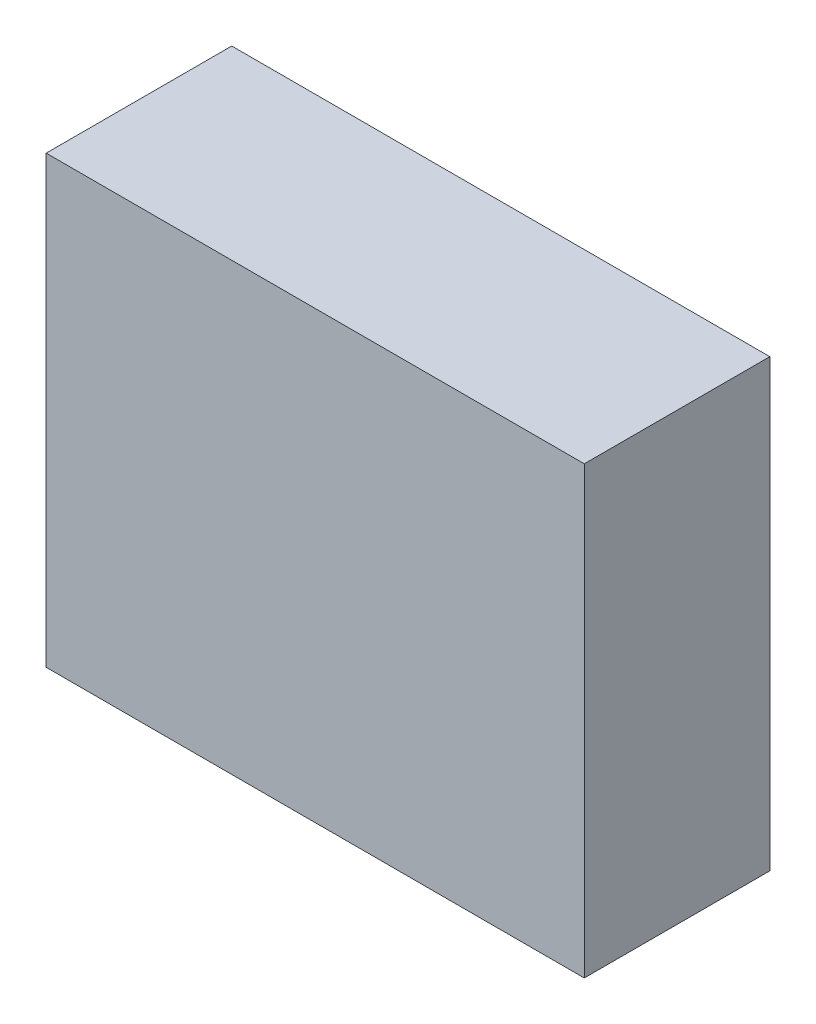
ISO-10303-21;
HEADER;
FILE_DESCRIPTION(('STEP AP214'),'2;1');
FILE_NAME('part.step','',(''),(''),'','','');
FILE_SCHEMA(('AUTOMOTIVE_DESIGN { 1 0 10303 214 1 1 1 1 }'));
ENDSEC;
DATA;
#1=APPLICATION_CONTEXT('core data for automotive mechanical design processes');
#2=APPLICATION_PROTOCOL_DEFINITION('international standard','automotive_design',2000,#1);
#3=PRODUCT_CONTEXT('',#1,'mechanical');
#4=PRODUCT('Part','Part','',(#3));
#5=PRODUCT_RELATED_PRODUCT_CATEGORY('part','',(#4));
#6=PRODUCT_DEFINITION_FORMATION('','',#4);
#7=PRODUCT_DEFINITION_CONTEXT('part definition',#1,'design');
#8=PRODUCT_DEFINITION('design','',#6,#7);
#9=PRODUCT_DEFINITION_SHAPE('','',#8);
#10=(LENGTH_UNIT() NAMED_UNIT(*) SI_UNIT(.MILLI.,.METRE.));
#11=(NAMED_UNIT(*) PLANE_ANGLE_UNIT() SI_UNIT($,.RADIAN.));
#12=(NAMED_UNIT(*) SI_UNIT($,.STERADIAN.) SOLID_ANGLE_UNIT());
#13=UNCERTAINTY_MEASURE_WITH_UNIT(LENGTH_MEASURE(1.E-05),#10,'distance_accuracy_value','');
#14=(GEOMETRIC_REPRESENTATION_CONTEXT(3) GLOBAL_UNCERTAINTY_ASSIGNED_CONTEXT((#13)) GLOBAL_UNIT_ASSIGNED_CONTEXT((#10,
#11,#12)) REPRESENTATION_CONTEXT('',''));
#15=CARTESIAN_POINT('',(0.,0.,0.));
#16=DIRECTION('',(0.,0.,1.));
#17=DIRECTION('',(1.,0.,0.));
#18=AXIS2_PLACEMENT_3D('',#15,#16,#17);
#19=CARTESIAN_POINT('',(0.496199068300616,16.5859707480032,-0.109999083028137));
#20=CARTESIAN_POINT('',(0.148199068300634,16.585970752153,-0.109999083028136));
#21=CARTESIAN_POINT('',(0.496199068300616,16.5859707375124,0.0100009169718631));
#22=CARTESIAN_POINT('',(0.148199068300633,16.5859707416623,0.0100009169718635));
#23=(BOUNDED_SURFACE() B_SPLINE_SURFACE(1,1,((#19,#20),(#21,#22)),.UNSPECIFIED.,.F.,.F.,
.F.) B_SPLINE_SURFACE_WITH_KNOTS((2,2),(2,2),(-1.E-05,0.00011),(-0.000318999999999984,
2.89999999999985E-05),
.UNSPECIFIED.) GEOMETRIC_REPRESENTATION_ITEM() RATIONAL_B_SPLINE_SURFACE(((1.,1.),(1.,1.))) REPRESENTATION_ITEM('') SURFACE());
#24=CARTESIAN_POINT('',(0.177199068300632,16.585970750933,-0.0999990830281364));
#25=CARTESIAN_POINT('',(0.467199068300617,16.5859707474748,-0.0999990830281367));
#26=(BOUNDED_CURVE() B_SPLINE_CURVE(1,(#24,#25),.UNSPECIFIED.,.F.,
.F.) B_SPLINE_CURVE_WITH_KNOTS((2,2),(0.,0.000289999999999985),
.UNSPECIFIED.) CURVE() GEOMETRIC_REPRESENTATION_ITEM() RATIONAL_B_SPLINE_CURVE((1.,1.)) REPRESENTATION_ITEM(''));
#27=CARTESIAN_POINT('',(0.177199068300632,16.585970750933,-0.0999990830281364));
#28=VERTEX_POINT('',#27);
#29=CARTESIAN_POINT('',(0.467199068300617,16.5859707474748,-0.0999990830281368));
#30=VERTEX_POINT('',#29);
#31=EDGE_CURVE('E62',#28,#30,#26,.T.);
#32=CARTESIAN_POINT('',(0.467199068300617,16.5859707387325,9.16971863024196E-07));
#33=CARTESIAN_POINT('',(0.467199068300617,16.5859707474748,-0.0999990830281368));
#34=(BOUNDED_CURVE() B_SPLINE_CURVE(1,(#32,#33),.UNSPECIFIED.,.F.,
.F.) B_SPLINE_CURVE_WITH_KNOTS((2,2),(0.,0.0001),
.UNSPECIFIED.) CURVE() GEOMETRIC_REPRESENTATION_ITEM() RATIONAL_B_SPLINE_CURVE((1.,1.)) REPRESENTATION_ITEM(''));
#35=CARTESIAN_POINT('',(0.467199068300617,16.5859707387325,9.16971863024196E-07));
#36=VERTEX_POINT('',#35);
#37=EDGE_CURVE('E91',#36,#30,#34,.T.);
#38=CARTESIAN_POINT('',(0.177199068300632,16.5859707421907,9.16971863457877E-07));
#39=CARTESIAN_POINT('',(0.467199068300617,16.5859707387325,9.1697186315555E-07));
#40=(BOUNDED_CURVE() B_SPLINE_CURVE(1,(#38,#39),.UNSPECIFIED.,.F.,
.F.) B_SPLINE_CURVE_WITH_KNOTS((2,2),(0.,0.000289999999999985),
.UNSPECIFIED.) CURVE() GEOMETRIC_REPRESENTATION_ITEM() RATIONAL_B_SPLINE_CURVE((1.,1.)) REPRESENTATION_ITEM(''));
#41=CARTESIAN_POINT('',(0.177199068300632,16.5859707421907,9.16971863457877E-07));
#42=VERTEX_POINT('',#41);
#43=EDGE_CURVE('E64',#42,#36,#40,.T.);
#44=CARTESIAN_POINT('',(0.177199068300632,16.5859707421907,9.16971863457877E-07));
#45=CARTESIAN_POINT('',(0.177199068300632,16.585970750933,-0.0999990830281364));
#46=(BOUNDED_CURVE() B_SPLINE_CURVE(1,(#44,#45),.UNSPECIFIED.,.F.,
.F.) B_SPLINE_CURVE_WITH_KNOTS((2,2),(0.,0.0001),
.UNSPECIFIED.) CURVE() GEOMETRIC_REPRESENTATION_ITEM() RATIONAL_B_SPLINE_CURVE((1.,1.)) REPRESENTATION_ITEM(''));
#47=EDGE_CURVE('E11',#42,#28,#46,.T.);
#48=ORIENTED_EDGE('',*,*,#31,.T.);
#49=ORIENTED_EDGE('',*,*,#37,.F.);
#50=ORIENTED_EDGE('',*,*,#43,.F.);
#51=ORIENTED_EDGE('',*,*,#47,.T.);
#52=EDGE_LOOP('',(#48,#49,#50,#51));
#53=FACE_BOUND('',#52,.T.);
#54=ADVANCED_FACE('F17',(#53),#23,.T.);
#55=CARTESIAN_POINT('',(0.496199071162606,16.8259707375124,0.0100009379533193));
#56=CARTESIAN_POINT('',(0.148199071162592,16.8259707416623,0.0100009379533196));
#57=CARTESIAN_POINT('',(0.496199071162606,16.8259707480032,-0.109999062046681));
#58=CARTESIAN_POINT('',(0.148199071162592,16.825970752153,-0.10999906204668));
#59=(BOUNDED_SURFACE() B_SPLINE_SURFACE(1,1,((#55,#56),(#57,#58)),.UNSPECIFIED.,.F.,.F.,
.F.) B_SPLINE_SURFACE_WITH_KNOTS((2,2),(2,2),(-1.E-05,0.00011),(-0.000319000000000013,
2.90000000000012E-05),
.UNSPECIFIED.) GEOMETRIC_REPRESENTATION_ITEM() RATIONAL_B_SPLINE_SURFACE(((1.,1.),(1.,1.))) REPRESENTATION_ITEM('') SURFACE());
#60=CARTESIAN_POINT('',(0.177199071162593,16.8259707421907,9.37953319613688E-07));
#61=CARTESIAN_POINT('',(0.177199071162593,16.825970750933,-0.0999990620466802));
#62=(BOUNDED_CURVE() B_SPLINE_CURVE(1,(#60,#61),.UNSPECIFIED.,.F.,
.F.) B_SPLINE_CURVE_WITH_KNOTS((2,2),(0.,0.0001),
.UNSPECIFIED.) CURVE() GEOMETRIC_REPRESENTATION_ITEM() RATIONAL_B_SPLINE_CURVE((1.,1.)) REPRESENTATION_ITEM(''));
#63=CARTESIAN_POINT('',(0.177199071162593,16.8259707421907,9.37953319613688E-07));
#64=VERTEX_POINT('',#63);
#65=CARTESIAN_POINT('',(0.177199071162593,16.825970750933,-0.0999990620466802));
#66=VERTEX_POINT('',#65);
#67=EDGE_CURVE('E23',#64,#66,#62,.T.);
#68=CARTESIAN_POINT('',(0.177199071162593,16.8259707421907,9.37953319613688E-07));
#69=CARTESIAN_POINT('',(0.467199071162605,16.8259707387325,9.37953319311361E-07));
#70=(BOUNDED_CURVE() B_SPLINE_CURVE(1,(#68,#69),.UNSPECIFIED.,.F.,
.F.) B_SPLINE_CURVE_WITH_KNOTS((2,2),(0.,0.000290000000000012),
.UNSPECIFIED.) CURVE() GEOMETRIC_REPRESENTATION_ITEM() RATIONAL_B_SPLINE_CURVE((1.,1.)) REPRESENTATION_ITEM(''));
#71=CARTESIAN_POINT('',(0.467199071162605,16.8259707387325,9.37953319180007E-07));
#72=VERTEX_POINT('',#71);
#73=EDGE_CURVE('E138',#64,#72,#70,.T.);
#74=CARTESIAN_POINT('',(0.467199071162605,16.8259707387325,9.37953319180007E-07));
#75=CARTESIAN_POINT('',(0.467199071162605,16.8259707474748,-0.0999990620466806));
#76=(BOUNDED_CURVE() B_SPLINE_CURVE(1,(#74,#75),.UNSPECIFIED.,.F.,
.F.) B_SPLINE_CURVE_WITH_KNOTS((2,2),(0.,0.0001),
.UNSPECIFIED.) CURVE() GEOMETRIC_REPRESENTATION_ITEM() RATIONAL_B_SPLINE_CURVE((1.,1.)) REPRESENTATION_ITEM(''));
#77=CARTESIAN_POINT('',(0.467199071162605,16.8259707474748,-0.0999990620466806));
#78=VERTEX_POINT('',#77);
#79=EDGE_CURVE('E98',#72,#78,#76,.T.);
#80=CARTESIAN_POINT('',(0.177199071162593,16.825970750933,-0.0999990620466802));
#81=CARTESIAN_POINT('',(0.467199071162605,16.8259707474748,-0.0999990620466805));
#82=(BOUNDED_CURVE() B_SPLINE_CURVE(1,(#80,#81),.UNSPECIFIED.,.F.,
.F.) B_SPLINE_CURVE_WITH_KNOTS((2,2),(0.,0.000290000000000012),
.UNSPECIFIED.) CURVE() GEOMETRIC_REPRESENTATION_ITEM() RATIONAL_B_SPLINE_CURVE((1.,1.)) REPRESENTATION_ITEM(''));
#83=EDGE_CURVE('E72',#66,#78,#82,.T.);
#84=ORIENTED_EDGE('',*,*,#67,.F.);
#85=ORIENTED_EDGE('',*,*,#73,.T.);
#86=ORIENTED_EDGE('',*,*,#79,.T.);
#87=ORIENTED_EDGE('',*,*,#83,.F.);
#88=EDGE_LOOP('',(#84,#85,#86,#87));
#89=FACE_BOUND('',#88,.T.);
#90=ADVANCED_FACE('F166',(#89),#59,.T.);
#91=CARTESIAN_POINT('',(0.177199068014435,16.5619707518072,-0.109999085126282));
#92=CARTESIAN_POINT('',(0.1771990714488,16.8499707518072,-0.109999059948535));
#93=CARTESIAN_POINT('',(0.177199068014435,16.5619707413165,0.0100009148737178));
#94=CARTESIAN_POINT('',(0.1771990714488,16.8499707413165,0.0100009400514652));
#95=(BOUNDED_SURFACE() B_SPLINE_SURFACE(1,1,((#91,#92),(#93,#94)),.UNSPECIFIED.,.F.,.F.,
.F.) B_SPLINE_SURFACE_WITH_KNOTS((2,2),(2,2),(-1.E-05,0.00011),(-2.4000000000004E-05,
0.000264000000000031),
.UNSPECIFIED.) GEOMETRIC_REPRESENTATION_ITEM() RATIONAL_B_SPLINE_SURFACE(((1.,1.),(1.,1.))) REPRESENTATION_ITEM('') SURFACE());
#96=CARTESIAN_POINT('',(0.177199068300632,16.585970750933,-0.0999990830281364));
#97=CARTESIAN_POINT('',(0.177199071162603,16.825970750933,-0.0999990620466803));
#98=(BOUNDED_CURVE() B_SPLINE_CURVE(1,(#96,#97),.UNSPECIFIED.,.F.,
.F.) B_SPLINE_CURVE_WITH_KNOTS((2,2),(0.,0.00024),
.UNSPECIFIED.) CURVE() GEOMETRIC_REPRESENTATION_ITEM() RATIONAL_B_SPLINE_CURVE((1.,1.)) REPRESENTATION_ITEM(''));
#99=EDGE_CURVE('E67',#28,#66,#98,.T.);
#100=CARTESIAN_POINT('',(0.177199068300632,16.5859707421907,9.16971863457877E-07));
#101=CARTESIAN_POINT('',(0.177199071162603,16.8259707421907,9.37953319603695E-07));
#102=(BOUNDED_CURVE() B_SPLINE_CURVE(1,(#100,#101),.UNSPECIFIED.,.F.,
.F.) B_SPLINE_CURVE_WITH_KNOTS((2,2),(0.,0.00024),
.UNSPECIFIED.) CURVE() GEOMETRIC_REPRESENTATION_ITEM() RATIONAL_B_SPLINE_CURVE((1.,1.)) REPRESENTATION_ITEM(''));
#103=EDGE_CURVE('E118',#42,#64,#102,.T.);
#104=ORIENTED_EDGE('',*,*,#67,.T.);
#105=ORIENTED_EDGE('',*,*,#99,.F.);
#106=ORIENTED_EDGE('',*,*,#47,.F.);
#107=ORIENTED_EDGE('',*,*,#103,.T.);
#108=EDGE_LOOP('',(#104,#105,#106,#107));
#109=FACE_BOUND('',#108,.T.);
#110=ADVANCED_FACE('F68',(#109),#95,.T.);
#111=CARTESIAN_POINT('',(0.46719906801442,16.5619707378583,0.0100009148737174));
#112=CARTESIAN_POINT('',(0.467199071448785,16.8499707378583,0.0100009400514648));
#113=CARTESIAN_POINT('',(0.46719906801442,16.561970748349,-0.109999085126282));
#114=CARTESIAN_POINT('',(0.467199071448785,16.849970748349,-0.109999059948535));
#115=(BOUNDED_SURFACE() B_SPLINE_SURFACE(1,1,((#111,#112),(#113,#114)),.UNSPECIFIED.,.F.,.F.,
.F.) B_SPLINE_SURFACE_WITH_KNOTS((2,2),(2,2),(-1.E-05,0.00011),(-2.4000000000004E-05,
0.000264000000000031),
.UNSPECIFIED.) GEOMETRIC_REPRESENTATION_ITEM() RATIONAL_B_SPLINE_SURFACE(((1.,1.),(1.,1.))) REPRESENTATION_ITEM('') SURFACE());
#116=CARTESIAN_POINT('',(0.467199068300617,16.5859707387325,9.16971863024196E-07));
#117=CARTESIAN_POINT('',(0.467199071162588,16.8259707387325,9.37953319170014E-07));
#118=(BOUNDED_CURVE() B_SPLINE_CURVE(1,(#116,#117),.UNSPECIFIED.,.F.,
.F.) B_SPLINE_CURVE_WITH_KNOTS((2,2),(0.,0.00024),
.UNSPECIFIED.) CURVE() GEOMETRIC_REPRESENTATION_ITEM() RATIONAL_B_SPLINE_CURVE((1.,1.)) REPRESENTATION_ITEM(''));
#119=EDGE_CURVE('E87',#36,#72,#118,.T.);
#120=CARTESIAN_POINT('',(0.467199068300617,16.5859707474748,-0.0999990830281368));
#121=CARTESIAN_POINT('',(0.467199071162588,16.8259707474748,-0.0999990620466807));
#122=(BOUNDED_CURVE() B_SPLINE_CURVE(1,(#120,#121),.UNSPECIFIED.,.F.,
.F.) B_SPLINE_CURVE_WITH_KNOTS((2,2),(0.,0.00024),
.UNSPECIFIED.) CURVE() GEOMETRIC_REPRESENTATION_ITEM() RATIONAL_B_SPLINE_CURVE((1.,1.)) REPRESENTATION_ITEM(''));
#123=EDGE_CURVE('E77',#30,#78,#122,.T.);
#124=ORIENTED_EDGE('',*,*,#119,.F.);
#125=ORIENTED_EDGE('',*,*,#37,.T.);
#126=ORIENTED_EDGE('',*,*,#123,.T.);
#127=ORIENTED_EDGE('',*,*,#79,.F.);
#128=EDGE_LOOP('',(#124,#125,#126,#127));
#129=FACE_BOUND('',#128,.T.);
#130=ADVANCED_FACE('F19',(#129),#115,.T.);
#131=CARTESIAN_POINT('',(0.148199071448789,16.8499707425365,9.40051465248511E-07));
#132=CARTESIAN_POINT('',(0.496199071448803,16.8499707383867,9.40051464885719E-07));
#133=CARTESIAN_POINT('',(0.148199068014423,16.5619707425365,9.14873717873527E-07));
#134=CARTESIAN_POINT('',(0.496199068014437,16.5619707383867,9.14873717510735E-07));
#135=(BOUNDED_SURFACE() B_SPLINE_SURFACE(1,1,((#131,#132),(#133,#134)),.UNSPECIFIED.,.F.,.F.,
.F.) B_SPLINE_SURFACE_WITH_KNOTS((2,2),(2,2),(-2.40000000000056E-05,0.00026400000000002),
(-2.90000000000115E-05,0.000319),
.UNSPECIFIED.) GEOMETRIC_REPRESENTATION_ITEM() RATIONAL_B_SPLINE_SURFACE(((1.,1.),(1.,1.))) REPRESENTATION_ITEM('') SURFACE());
#136=ORIENTED_EDGE('',*,*,#119,.T.);
#137=ORIENTED_EDGE('',*,*,#73,.F.);
#138=ORIENTED_EDGE('',*,*,#103,.F.);
#139=ORIENTED_EDGE('',*,*,#43,.T.);
#140=EDGE_LOOP('',(#136,#137,#138,#139));
#141=FACE_BOUND('',#140,.T.);
#142=ADVANCED_FACE('F193',(#141),#135,.T.);
#143=CARTESIAN_POINT('',(0.148199068014423,16.5619707512788,-0.099999085126282));
#144=CARTESIAN_POINT('',(0.496199068014438,16.561970747129,-0.0999990851262823));
#145=CARTESIAN_POINT('',(0.148199071448789,16.8499707512788,-0.0999990599485346));
#146=CARTESIAN_POINT('',(0.496199071448803,16.849970747129,-0.099999059948535));
#147=(BOUNDED_SURFACE() B_SPLINE_SURFACE(1,1,((#143,#144),(#145,#146)),.UNSPECIFIED.,.F.,.F.,
.F.) B_SPLINE_SURFACE_WITH_KNOTS((2,2),(2,2),(-2.40000000000024E-05,0.00026400000000002),
(-2.90000000000116E-05,0.000319),
.UNSPECIFIED.) GEOMETRIC_REPRESENTATION_ITEM() RATIONAL_B_SPLINE_SURFACE(((1.,1.),(1.,1.))) REPRESENTATION_ITEM('') SURFACE());
#148=ORIENTED_EDGE('',*,*,#31,.F.);
#149=ORIENTED_EDGE('',*,*,#99,.T.);
#150=ORIENTED_EDGE('',*,*,#83,.T.);
#151=ORIENTED_EDGE('',*,*,#123,.F.);
#152=EDGE_LOOP('',(#148,#149,#150,#151));
#153=FACE_BOUND('',#152,.T.);
#154=ADVANCED_FACE('F75',(#153),#147,.T.);
#155=CLOSED_SHELL('',(#54,#90,#110,#130,#142,#154));
#156=MANIFOLD_SOLID_BREP('B1',#155);
#157=ADVANCED_BREP_SHAPE_REPRESENTATION('',(#18,#156),#14);
#158=SHAPE_DEFINITION_REPRESENTATION(#9,#157);
ENDSEC;
END-ISO-10303-21;
